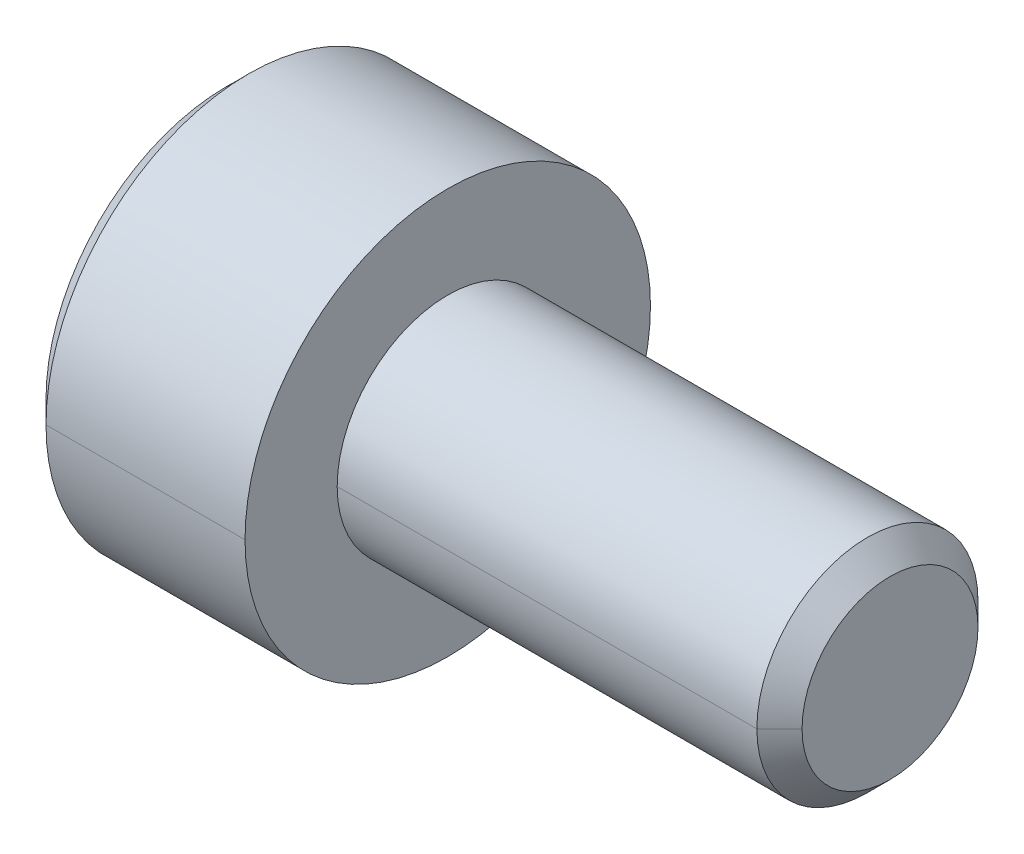
ISO-10303-21;
HEADER;
FILE_DESCRIPTION(('STEP AP214'),'2;1');
FILE_NAME('part.step','',(''),(''),'','','');
FILE_SCHEMA(('AUTOMOTIVE_DESIGN { 1 0 10303 214 1 1 1 1 }'));
ENDSEC;
DATA;
#1=APPLICATION_CONTEXT('core data for automotive mechanical design processes');
#2=APPLICATION_PROTOCOL_DEFINITION('international standard','automotive_design',2000,#1);
#3=PRODUCT_CONTEXT('',#1,'mechanical');
#4=PRODUCT('Part','Part','',(#3));
#5=PRODUCT_RELATED_PRODUCT_CATEGORY('part','',(#4));
#6=PRODUCT_DEFINITION_FORMATION('','',#4);
#7=PRODUCT_DEFINITION_CONTEXT('part definition',#1,'design');
#8=PRODUCT_DEFINITION('design','',#6,#7);
#9=PRODUCT_DEFINITION_SHAPE('','',#8);
#10=(LENGTH_UNIT() NAMED_UNIT(*) SI_UNIT(.MILLI.,.METRE.));
#11=(NAMED_UNIT(*) PLANE_ANGLE_UNIT() SI_UNIT($,.RADIAN.));
#12=(NAMED_UNIT(*) SI_UNIT($,.STERADIAN.) SOLID_ANGLE_UNIT());
#13=UNCERTAINTY_MEASURE_WITH_UNIT(LENGTH_MEASURE(1.E-05),#10,'distance_accuracy_value','');
#14=(GEOMETRIC_REPRESENTATION_CONTEXT(3) GLOBAL_UNCERTAINTY_ASSIGNED_CONTEXT((#13)) GLOBAL_UNIT_ASSIGNED_CONTEXT((#10,
#11,#12)) REPRESENTATION_CONTEXT('',''));
#15=CARTESIAN_POINT('',(0.,0.,0.));
#16=DIRECTION('',(0.,0.,1.));
#17=DIRECTION('',(1.,0.,0.));
#18=AXIS2_PLACEMENT_3D('',#15,#16,#17);
#19=CARTESIAN_POINT('',(-3.,0.,0.));
#20=DIRECTION('',(1.,0.,0.));
#21=DIRECTION('',(0.,-1.,0.));
#22=AXIS2_PLACEMENT_3D('',#19,#20,#21);
#23=CONICAL_SURFACE('',#22,2.45,0.7853981634);
#24=CARTESIAN_POINT('',(-2.7,0.,0.));
#25=DIRECTION('',(1.,0.,0.));
#26=DIRECTION('',(0.,0.,-1.));
#27=AXIS2_PLACEMENT_3D('',#24,#25,#26);
#28=CIRCLE('',#27,2.75);
#29=CARTESIAN_POINT('',(-2.7,0.,-2.75));
#30=VERTEX_POINT('',#29);
#31=CARTESIAN_POINT('',(-2.70000000000077,0.,2.75000000000077));
#32=VERTEX_POINT('',#31);
#33=EDGE_CURVE('E12',#30,#32,#28,.T.);
#34=ORIENTED_EDGE('',*,*,#33,.F.);
#35=CARTESIAN_POINT('',(-3.,0.,-2.45));
#36=DIRECTION('',(0.707106781184743,0.,-0.707106781188352));
#37=VECTOR('',#36,1.);
#38=LINE('',#35,#37);
#39=CARTESIAN_POINT('',(-3.,0.,-2.45));
#40=VERTEX_POINT('',#39);
#41=EDGE_CURVE('E30',#40,#30,#38,.T.);
#42=ORIENTED_EDGE('',*,*,#41,.F.);
#43=CARTESIAN_POINT('',(-3.,0.,0.));
#44=DIRECTION('',(1.,0.,0.));
#45=DIRECTION('',(0.,0.,-1.));
#46=AXIS2_PLACEMENT_3D('',#43,#44,#45);
#47=CIRCLE('',#46,2.45);
#48=CARTESIAN_POINT('',(-3.,0.,2.45));
#49=VERTEX_POINT('',#48);
#50=EDGE_CURVE('E958',#40,#49,#47,.T.);
#51=ORIENTED_EDGE('',*,*,#50,.T.);
#52=CARTESIAN_POINT('',(-3.,0.,2.45));
#53=DIRECTION('',(0.707106781184743,0.,0.707106781188352));
#54=VECTOR('',#53,1.);
#55=LINE('',#52,#54);
#56=EDGE_CURVE('E371',#49,#32,#55,.T.);
#57=ORIENTED_EDGE('',*,*,#56,.T.);
#58=EDGE_LOOP('',(#34,#42,#51,#57));
#59=FACE_BOUND('',#58,.T.);
#60=ADVANCED_FACE('F20',(#59),#23,.T.);
#61=CARTESIAN_POINT('',(-3.,0.,0.));
#62=DIRECTION('',(1.,0.,0.));
#63=DIRECTION('',(0.,1.,0.));
#64=AXIS2_PLACEMENT_3D('',#61,#62,#63);
#65=CONICAL_SURFACE('',#64,2.45,0.7853981634);
#66=CARTESIAN_POINT('',(-3.,0.,0.));
#67=DIRECTION('',(1.,0.,0.));
#68=DIRECTION('',(0.,0.,-1.));
#69=AXIS2_PLACEMENT_3D('',#66,#67,#68);
#70=CIRCLE('',#69,2.45);
#71=EDGE_CURVE('E376',#49,#40,#70,.T.);
#72=ORIENTED_EDGE('',*,*,#71,.T.);
#73=ORIENTED_EDGE('',*,*,#41,.T.);
#74=CARTESIAN_POINT('',(-2.7,0.,0.));
#75=DIRECTION('',(1.,0.,0.));
#76=DIRECTION('',(0.,0.,-1.));
#77=AXIS2_PLACEMENT_3D('',#74,#75,#76);
#78=CIRCLE('',#77,2.75);
#79=EDGE_CURVE('E373',#32,#30,#78,.T.);
#80=ORIENTED_EDGE('',*,*,#79,.F.);
#81=ORIENTED_EDGE('',*,*,#56,.F.);
#82=EDGE_LOOP('',(#72,#73,#80,#81));
#83=FACE_BOUND('',#82,.T.);
#84=ADVANCED_FACE('F344',(#83),#65,.T.);
#85=CARTESIAN_POINT('',(6.,0.,0.));
#86=DIRECTION('',(-1.,0.,0.));
#87=DIRECTION('',(0.,1.,0.));
#88=AXIS2_PLACEMENT_3D('',#85,#86,#87);
#89=CYLINDRICAL_SURFACE('',#88,2.75);
#90=ORIENTED_EDGE('',*,*,#79,.T.);
#91=CARTESIAN_POINT('',(0.,0.,-2.75));
#92=DIRECTION('',(-1.,0.,0.));
#93=VECTOR('',#92,1.);
#94=LINE('',#91,#93);
#95=CARTESIAN_POINT('',(0.,0.,-2.75));
#96=VERTEX_POINT('',#95);
#97=EDGE_CURVE('E377',#96,#30,#94,.T.);
#98=ORIENTED_EDGE('',*,*,#97,.F.);
#99=CARTESIAN_POINT('',(0.,0.,0.));
#100=DIRECTION('',(1.,0.,0.));
#101=DIRECTION('',(0.,0.,-1.));
#102=AXIS2_PLACEMENT_3D('',#99,#100,#101);
#103=CIRCLE('',#102,2.75);
#104=CARTESIAN_POINT('',(0.,0.,2.75));
#105=VERTEX_POINT('',#104);
#106=EDGE_CURVE('E384',#105,#96,#103,.T.);
#107=ORIENTED_EDGE('',*,*,#106,.F.);
#108=CARTESIAN_POINT('',(0.,0.,2.75));
#109=DIRECTION('',(-1.,0.,0.));
#110=VECTOR('',#109,1.);
#111=LINE('',#108,#110);
#112=EDGE_CURVE('E390',#105,#32,#111,.T.);
#113=ORIENTED_EDGE('',*,*,#112,.T.);
#114=EDGE_LOOP('',(#90,#98,#107,#113));
#115=FACE_BOUND('',#114,.T.);
#116=ADVANCED_FACE('F353',(#115),#89,.T.);
#117=CARTESIAN_POINT('',(6.,0.,0.));
#118=DIRECTION('',(-1.,0.,0.));
#119=DIRECTION('',(0.,-1.,0.));
#120=AXIS2_PLACEMENT_3D('',#117,#118,#119);
#121=CYLINDRICAL_SURFACE('',#120,2.75);
#122=CARTESIAN_POINT('',(0.,0.,0.));
#123=DIRECTION('',(1.,0.,0.));
#124=DIRECTION('',(0.,0.,-1.));
#125=AXIS2_PLACEMENT_3D('',#122,#123,#124);
#126=CIRCLE('',#125,2.75);
#127=EDGE_CURVE('E395',#96,#105,#126,.T.);
#128=ORIENTED_EDGE('',*,*,#127,.F.);
#129=ORIENTED_EDGE('',*,*,#97,.T.);
#130=ORIENTED_EDGE('',*,*,#33,.T.);
#131=ORIENTED_EDGE('',*,*,#112,.F.);
#132=EDGE_LOOP('',(#128,#129,#130,#131));
#133=FACE_BOUND('',#132,.T.);
#134=ADVANCED_FACE('F508',(#133),#121,.T.);
#135=CARTESIAN_POINT('',(0.,2.75,0.));
#136=DIRECTION('',(-1.,0.,0.));
#137=DIRECTION('',(0.,0.,1.));
#138=AXIS2_PLACEMENT_3D('',#135,#136,#137);
#139=PLANE('',#138);
#140=CARTESIAN_POINT('',(0.,0.,0.));
#141=DIRECTION('',(1.,0.,0.));
#142=DIRECTION('',(0.,0.,-1.));
#143=AXIS2_PLACEMENT_3D('',#140,#141,#142);
#144=CIRCLE('',#143,1.5);
#145=CARTESIAN_POINT('',(0.,0.,-1.5));
#146=VERTEX_POINT('',#145);
#147=CARTESIAN_POINT('',(0.,0.,1.5));
#148=VERTEX_POINT('',#147);
#149=EDGE_CURVE('E498',#146,#148,#144,.T.);
#150=ORIENTED_EDGE('',*,*,#149,.F.);
#151=CARTESIAN_POINT('',(0.,0.,0.));
#152=DIRECTION('',(1.,0.,0.));
#153=DIRECTION('',(0.,0.,-1.));
#154=AXIS2_PLACEMENT_3D('',#151,#152,#153);
#155=CIRCLE('',#154,1.5);
#156=EDGE_CURVE('E497',#148,#146,#155,.T.);
#157=ORIENTED_EDGE('',*,*,#156,.F.);
#158=EDGE_LOOP('',(#150,#157));
#159=FACE_BOUND('',#158,.T.);
#160=ORIENTED_EDGE('',*,*,#127,.T.);
#161=ORIENTED_EDGE('',*,*,#106,.T.);
#162=EDGE_LOOP('',(#160,#161));
#163=FACE_BOUND('',#162,.T.);
#164=ADVANCED_FACE('F516',(#159,#163),#139,.F.);
#165=CARTESIAN_POINT('',(6.,0.,0.));
#166=DIRECTION('',(-1.,0.,0.));
#167=DIRECTION('',(0.,1.,0.));
#168=AXIS2_PLACEMENT_3D('',#165,#166,#167);
#169=CYLINDRICAL_SURFACE('',#168,1.5);
#170=ORIENTED_EDGE('',*,*,#156,.T.);
#171=CARTESIAN_POINT('',(5.6935,0.,-1.5));
#172=DIRECTION('',(-1.,0.,0.));
#173=VECTOR('',#172,1.);
#174=LINE('',#171,#173);
#175=CARTESIAN_POINT('',(5.6935,0.,-1.5));
#176=VERTEX_POINT('',#175);
#177=EDGE_CURVE('E482',#176,#146,#174,.T.);
#178=ORIENTED_EDGE('',*,*,#177,.F.);
#179=CARTESIAN_POINT('',(5.6935,0.,0.));
#180=DIRECTION('',(1.,0.,0.));
#181=DIRECTION('',(0.,0.,-1.));
#182=AXIS2_PLACEMENT_3D('',#179,#180,#181);
#183=CIRCLE('',#182,1.5);
#184=CARTESIAN_POINT('',(5.6935,0.,1.5));
#185=VERTEX_POINT('',#184);
#186=EDGE_CURVE('E479',#185,#176,#183,.T.);
#187=ORIENTED_EDGE('',*,*,#186,.F.);
#188=CARTESIAN_POINT('',(5.6935,0.,1.5));
#189=DIRECTION('',(-1.,0.,0.));
#190=VECTOR('',#189,1.);
#191=LINE('',#188,#190);
#192=EDGE_CURVE('E477',#185,#148,#191,.T.);
#193=ORIENTED_EDGE('',*,*,#192,.T.);
#194=EDGE_LOOP('',(#170,#178,#187,#193));
#195=FACE_BOUND('',#194,.T.);
#196=ADVANCED_FACE('F443',(#195),#169,.T.);
#197=CARTESIAN_POINT('',(6.,0.,0.));
#198=DIRECTION('',(-1.,0.,0.));
#199=DIRECTION('',(0.,-1.,0.));
#200=AXIS2_PLACEMENT_3D('',#197,#198,#199);
#201=CYLINDRICAL_SURFACE('',#200,1.5);
#202=CARTESIAN_POINT('',(5.6935,0.,0.));
#203=DIRECTION('',(1.,0.,0.));
#204=DIRECTION('',(0.,0.,-1.));
#205=AXIS2_PLACEMENT_3D('',#202,#203,#204);
#206=CIRCLE('',#205,1.5);
#207=EDGE_CURVE('E918',#176,#185,#206,.T.);
#208=ORIENTED_EDGE('',*,*,#207,.F.);
#209=ORIENTED_EDGE('',*,*,#177,.T.);
#210=ORIENTED_EDGE('',*,*,#149,.T.);
#211=ORIENTED_EDGE('',*,*,#192,.F.);
#212=EDGE_LOOP('',(#208,#209,#210,#211));
#213=FACE_BOUND('',#212,.T.);
#214=ADVANCED_FACE('F434',(#213),#201,.T.);
#215=CARTESIAN_POINT('',(5.6935,0.,0.));
#216=DIRECTION('',(-1.,0.,0.));
#217=DIRECTION('',(0.,-1.,0.));
#218=AXIS2_PLACEMENT_3D('',#215,#216,#217);
#219=CONICAL_SURFACE('',#218,1.5,0.7853981634);
#220=CARTESIAN_POINT('',(6.,0.,0.));
#221=DIRECTION('',(1.,0.,0.));
#222=DIRECTION('',(0.,0.,-1.));
#223=AXIS2_PLACEMENT_3D('',#220,#221,#222);
#224=CIRCLE('',#223,1.1935);
#225=CARTESIAN_POINT('',(6.,0.,-1.1935));
#226=VERTEX_POINT('',#225);
#227=CARTESIAN_POINT('',(5.99999999999922,0.,1.19349999999922));
#228=VERTEX_POINT('',#227);
#229=EDGE_CURVE('E427',#226,#228,#224,.T.);
#230=ORIENTED_EDGE('',*,*,#229,.F.);
#231=CARTESIAN_POINT('',(5.99999999999922,0.,-1.19349999999922));
#232=DIRECTION('',(-0.707106781184743,0.,-0.707106781188352));
#233=VECTOR('',#232,1.);
#234=LINE('',#231,#233);
#235=EDGE_CURVE('E305',#226,#176,#234,.T.);
#236=ORIENTED_EDGE('',*,*,#235,.T.);
#237=ORIENTED_EDGE('',*,*,#207,.T.);
#238=CARTESIAN_POINT('',(5.99999999999922,0.,1.19349999999922));
#239=DIRECTION('',(-0.707106781184743,0.,0.707106781188352));
#240=VECTOR('',#239,1.);
#241=LINE('',#238,#240);
#242=EDGE_CURVE('E318',#228,#185,#241,.T.);
#243=ORIENTED_EDGE('',*,*,#242,.F.);
#244=EDGE_LOOP('',(#230,#236,#237,#243));
#245=FACE_BOUND('',#244,.T.);
#246=ADVANCED_FACE('F283',(#245),#219,.T.);
#247=CARTESIAN_POINT('',(5.6935,0.,0.));
#248=DIRECTION('',(-1.,0.,0.));
#249=DIRECTION('',(0.,1.,0.));
#250=AXIS2_PLACEMENT_3D('',#247,#248,#249);
#251=CONICAL_SURFACE('',#250,1.5,0.7853981634);
#252=ORIENTED_EDGE('',*,*,#186,.T.);
#253=ORIENTED_EDGE('',*,*,#235,.F.);
#254=CARTESIAN_POINT('',(6.,0.,0.));
#255=DIRECTION('',(1.,0.,0.));
#256=DIRECTION('',(0.,0.,-1.));
#257=AXIS2_PLACEMENT_3D('',#254,#255,#256);
#258=CIRCLE('',#257,1.1935);
#259=EDGE_CURVE('E911',#228,#226,#258,.T.);
#260=ORIENTED_EDGE('',*,*,#259,.F.);
#261=ORIENTED_EDGE('',*,*,#242,.T.);
#262=EDGE_LOOP('',(#252,#253,#260,#261));
#263=FACE_BOUND('',#262,.T.);
#264=ADVANCED_FACE('F272',(#263),#251,.T.);
#265=CARTESIAN_POINT('',(6.,1.1935,0.));
#266=DIRECTION('',(-1.,0.,0.));
#267=DIRECTION('',(0.,0.,1.));
#268=AXIS2_PLACEMENT_3D('',#265,#266,#267);
#269=PLANE('',#268);
#270=ORIENTED_EDGE('',*,*,#229,.T.);
#271=ORIENTED_EDGE('',*,*,#259,.T.);
#272=EDGE_LOOP('',(#270,#271));
#273=FACE_BOUND('',#272,.T.);
#274=ADVANCED_FACE('F282',(#273),#269,.F.);
#275=CARTESIAN_POINT('',(-3.,0.,0.));
#276=DIRECTION('',(1.,0.,0.));
#277=DIRECTION('',(0.,0.,-1.));
#278=AXIS2_PLACEMENT_3D('',#275,#276,#277);
#279=PLANE('',#278);
#280=ORIENTED_EDGE('',*,*,#50,.F.);
#281=ORIENTED_EDGE('',*,*,#71,.F.);
#282=EDGE_LOOP('',(#280,#281));
#283=FACE_BOUND('',#282,.T.);
#284=DIRECTION('',(0.,0.50000000000002,-0.866025403784427));
#285=VECTOR('',#284,1.);
#286=CARTESIAN_POINT('',(-3.,-1.4433756729741,0.));
#287=LINE('',#286,#285);
#288=CARTESIAN_POINT('',(-3.,-1.4433756729741,0.));
#289=VERTEX_POINT('',#288);
#290=CARTESIAN_POINT('',(-3.,-0.72168783648703,-1.25));
#291=VERTEX_POINT('',#290);
#292=EDGE_CURVE('E263',#289,#291,#287,.T.);
#293=ORIENTED_EDGE('',*,*,#292,.T.);
#294=DIRECTION('',(0.,1.,0.));
#295=VECTOR('',#294,1.);
#296=CARTESIAN_POINT('',(-3.,-0.72168783648703,-1.25));
#297=LINE('',#296,#295);
#298=CARTESIAN_POINT('',(-3.,0.72168783648703,-1.25));
#299=VERTEX_POINT('',#298);
#300=EDGE_CURVE('E895',#291,#299,#297,.T.);
#301=ORIENTED_EDGE('',*,*,#300,.T.);
#302=DIRECTION('',(0.,0.50000000000002,0.866025403784427));
#303=VECTOR('',#302,1.);
#304=CARTESIAN_POINT('',(-3.,0.72168783648703,-1.25));
#305=LINE('',#304,#303);
#306=CARTESIAN_POINT('',(-3.,1.4433756729741,0.));
#307=VERTEX_POINT('',#306);
#308=EDGE_CURVE('E891',#299,#307,#305,.T.);
#309=ORIENTED_EDGE('',*,*,#308,.T.);
#310=DIRECTION('',(0.,-0.50000000000002,0.866025403784427));
#311=VECTOR('',#310,1.);
#312=CARTESIAN_POINT('',(-3.,1.4433756729741,0.));
#313=LINE('',#312,#311);
#314=CARTESIAN_POINT('',(-3.,0.72168783648703,1.25));
#315=VERTEX_POINT('',#314);
#316=EDGE_CURVE('E887',#307,#315,#313,.T.);
#317=ORIENTED_EDGE('',*,*,#316,.T.);
#318=DIRECTION('',(0.,-1.,0.));
#319=VECTOR('',#318,1.);
#320=CARTESIAN_POINT('',(-3.,0.72168783648703,1.25));
#321=LINE('',#320,#319);
#322=CARTESIAN_POINT('',(-3.,-0.72168783648703,1.25));
#323=VERTEX_POINT('',#322);
#324=EDGE_CURVE('E246',#315,#323,#321,.T.);
#325=ORIENTED_EDGE('',*,*,#324,.T.);
#326=DIRECTION('',(0.,-0.50000000000002,-0.866025403784427));
#327=VECTOR('',#326,1.);
#328=CARTESIAN_POINT('',(-3.,-0.72168783648703,1.25));
#329=LINE('',#328,#327);
#330=EDGE_CURVE('E241',#323,#289,#329,.T.);
#331=ORIENTED_EDGE('',*,*,#330,.T.);
#332=EDGE_LOOP('',(#293,#301,#309,#317,#325,#331));
#333=FACE_BOUND('',#332,.T.);
#334=ADVANCED_FACE('F581',(#283,#333),#279,.F.);
#335=CARTESIAN_POINT('',(-1.7,-0.72168783648703,1.25));
#336=DIRECTION('',(0.,0.866025403784427,-0.50000000000002));
#337=DIRECTION('',(0.,0.50000000000002,0.866025403784427));
#338=AXIS2_PLACEMENT_3D('',#335,#336,#337);
#339=PLANE('',#338);
#340=ORIENTED_EDGE('',*,*,#330,.F.);
#341=DIRECTION('',(-1.,0.,0.));
#342=VECTOR('',#341,1.);
#343=CARTESIAN_POINT('',(-1.7,-0.72168783648703,1.25));
#344=LINE('',#343,#342);
#345=CARTESIAN_POINT('',(-1.7,-0.72168783648703,1.25));
#346=VERTEX_POINT('',#345);
#347=EDGE_CURVE('E235',#346,#323,#344,.T.);
#348=ORIENTED_EDGE('',*,*,#347,.F.);
#349=DIRECTION('',(0.,-0.50000000000002,-0.866025403784427));
#350=VECTOR('',#349,1.);
#351=CARTESIAN_POINT('',(-1.7,-0.72168783648703,1.25));
#352=LINE('',#351,#350);
#353=CARTESIAN_POINT('',(-1.7,-1.08253175473055,0.625000000000032));
#354=VERTEX_POINT('',#353);
#355=EDGE_CURVE('E230',#346,#354,#352,.T.);
#356=ORIENTED_EDGE('',*,*,#355,.T.);
#357=DIRECTION('',(0.,-0.50000000000002,-0.866025403784427));
#358=VECTOR('',#357,1.);
#359=CARTESIAN_POINT('',(-1.7,-0.72168783648703,1.25));
#360=LINE('',#359,#358);
#361=CARTESIAN_POINT('',(-1.7,-1.4433756729741,0.));
#362=VERTEX_POINT('',#361);
#363=EDGE_CURVE('E225',#354,#362,#360,.T.);
#364=ORIENTED_EDGE('',*,*,#363,.T.);
#365=DIRECTION('',(-1.,0.,0.));
#366=VECTOR('',#365,1.);
#367=CARTESIAN_POINT('',(-1.7,-1.4433756729741,0.));
#368=LINE('',#367,#366);
#369=EDGE_CURVE('E219',#362,#289,#368,.T.);
#370=ORIENTED_EDGE('',*,*,#369,.T.);
#371=EDGE_LOOP('',(#340,#348,#356,#364,#370));
#372=FACE_BOUND('',#371,.T.);
#373=ADVANCED_FACE('F589',(#372),#339,.T.);
#374=CARTESIAN_POINT('',(-1.7,-1.4433756729741,0.));
#375=DIRECTION('',(0.,0.866025403784427,0.50000000000002));
#376=DIRECTION('',(0.,-0.50000000000002,0.866025403784427));
#377=AXIS2_PLACEMENT_3D('',#374,#375,#376);
#378=PLANE('',#377);
#379=ORIENTED_EDGE('',*,*,#292,.F.);
#380=ORIENTED_EDGE('',*,*,#369,.F.);
#381=DIRECTION('',(0.,0.50000000000002,-0.866025403784427));
#382=VECTOR('',#381,1.);
#383=CARTESIAN_POINT('',(-1.7,-1.4433756729741,0.));
#384=LINE('',#383,#382);
#385=CARTESIAN_POINT('',(-1.7,-1.08253175473053,-0.625000000000024));
#386=VERTEX_POINT('',#385);
#387=EDGE_CURVE('E214',#362,#386,#384,.T.);
#388=ORIENTED_EDGE('',*,*,#387,.T.);
#389=DIRECTION('',(0.,0.50000000000002,-0.866025403784427));
#390=VECTOR('',#389,1.);
#391=CARTESIAN_POINT('',(-1.7,-1.4433756729741,0.));
#392=LINE('',#391,#390);
#393=CARTESIAN_POINT('',(-1.7,-0.72168783648703,-1.25));
#394=VERTEX_POINT('',#393);
#395=EDGE_CURVE('E209',#386,#394,#392,.T.);
#396=ORIENTED_EDGE('',*,*,#395,.T.);
#397=DIRECTION('',(-1.,0.,0.));
#398=VECTOR('',#397,1.);
#399=CARTESIAN_POINT('',(-1.7,-0.72168783648703,-1.25));
#400=LINE('',#399,#398);
#401=EDGE_CURVE('E203',#394,#291,#400,.T.);
#402=ORIENTED_EDGE('',*,*,#401,.T.);
#403=EDGE_LOOP('',(#379,#380,#388,#396,#402));
#404=FACE_BOUND('',#403,.T.);
#405=ADVANCED_FACE('F597',(#404),#378,.T.);
#406=CARTESIAN_POINT('',(-1.7,-0.72168783648703,-1.25));
#407=DIRECTION('',(0.,0.,1.));
#408=DIRECTION('',(1.,0.,0.));
#409=AXIS2_PLACEMENT_3D('',#406,#407,#408);
#410=PLANE('',#409);
#411=ORIENTED_EDGE('',*,*,#300,.F.);
#412=ORIENTED_EDGE('',*,*,#401,.F.);
#413=DIRECTION('',(0.,1.,0.));
#414=VECTOR('',#413,1.);
#415=CARTESIAN_POINT('',(-1.7,-0.72168783648703,-1.25));
#416=LINE('',#415,#414);
#417=CARTESIAN_POINT('',(-1.7,0.,-1.25));
#418=VERTEX_POINT('',#417);
#419=EDGE_CURVE('E198',#394,#418,#416,.T.);
#420=ORIENTED_EDGE('',*,*,#419,.T.);
#421=DIRECTION('',(0.,1.,0.));
#422=VECTOR('',#421,1.);
#423=CARTESIAN_POINT('',(-1.7,-0.72168783648703,-1.25));
#424=LINE('',#423,#422);
#425=CARTESIAN_POINT('',(-1.7,0.72168783648703,-1.25));
#426=VERTEX_POINT('',#425);
#427=EDGE_CURVE('E193',#418,#426,#424,.T.);
#428=ORIENTED_EDGE('',*,*,#427,.T.);
#429=DIRECTION('',(-1.,0.,0.));
#430=VECTOR('',#429,1.);
#431=CARTESIAN_POINT('',(-1.7,0.72168783648703,-1.25));
#432=LINE('',#431,#430);
#433=EDGE_CURVE('E187',#426,#299,#432,.T.);
#434=ORIENTED_EDGE('',*,*,#433,.T.);
#435=EDGE_LOOP('',(#411,#412,#420,#428,#434));
#436=FACE_BOUND('',#435,.T.);
#437=ADVANCED_FACE('F606',(#436),#410,.T.);
#438=CARTESIAN_POINT('',(-1.7,0.72168783648703,-1.25));
#439=DIRECTION('',(0.,-0.866025403784427,0.50000000000002));
#440=DIRECTION('',(0.,-0.50000000000002,-0.866025403784427));
#441=AXIS2_PLACEMENT_3D('',#438,#439,#440);
#442=PLANE('',#441);
#443=ORIENTED_EDGE('',*,*,#308,.F.);
#444=ORIENTED_EDGE('',*,*,#433,.F.);
#445=DIRECTION('',(0.,0.50000000000002,0.866025403784427));
#446=VECTOR('',#445,1.);
#447=CARTESIAN_POINT('',(-1.7,0.72168783648703,-1.25));
#448=LINE('',#447,#446);
#449=CARTESIAN_POINT('',(-1.7,1.08253175473055,-0.625000000000032));
#450=VERTEX_POINT('',#449);
#451=EDGE_CURVE('E183',#426,#450,#448,.T.);
#452=ORIENTED_EDGE('',*,*,#451,.T.);
#453=DIRECTION('',(0.,0.50000000000002,0.866025403784427));
#454=VECTOR('',#453,1.);
#455=CARTESIAN_POINT('',(-1.7,0.72168783648703,-1.25));
#456=LINE('',#455,#454);
#457=CARTESIAN_POINT('',(-1.7,1.4433756729741,0.));
#458=VERTEX_POINT('',#457);
#459=EDGE_CURVE('E181',#450,#458,#456,.T.);
#460=ORIENTED_EDGE('',*,*,#459,.T.);
#461=DIRECTION('',(-1.,0.,0.));
#462=VECTOR('',#461,1.);
#463=CARTESIAN_POINT('',(-1.7,1.4433756729741,0.));
#464=LINE('',#463,#462);
#465=EDGE_CURVE('E868',#458,#307,#464,.T.);
#466=ORIENTED_EDGE('',*,*,#465,.T.);
#467=EDGE_LOOP('',(#443,#444,#452,#460,#466));
#468=FACE_BOUND('',#467,.T.);
#469=ADVANCED_FACE('F615',(#468),#442,.T.);
#470=CARTESIAN_POINT('',(-1.7,1.4433756729741,0.));
#471=DIRECTION('',(0.,-0.866025403784427,-0.50000000000002));
#472=DIRECTION('',(0.,0.50000000000002,-0.866025403784427));
#473=AXIS2_PLACEMENT_3D('',#470,#471,#472);
#474=PLANE('',#473);
#475=ORIENTED_EDGE('',*,*,#316,.F.);
#476=ORIENTED_EDGE('',*,*,#465,.F.);
#477=DIRECTION('',(0.,-0.50000000000002,0.866025403784427));
#478=VECTOR('',#477,1.);
#479=CARTESIAN_POINT('',(-1.7,1.4433756729741,0.));
#480=LINE('',#479,#478);
#481=CARTESIAN_POINT('',(-1.7,1.08253175473055,0.625000000000032));
#482=VERTEX_POINT('',#481);
#483=EDGE_CURVE('E858',#458,#482,#480,.T.);
#484=ORIENTED_EDGE('',*,*,#483,.T.);
#485=DIRECTION('',(0.,-0.50000000000002,0.866025403784427));
#486=VECTOR('',#485,1.);
#487=CARTESIAN_POINT('',(-1.7,1.4433756729741,0.));
#488=LINE('',#487,#486);
#489=CARTESIAN_POINT('',(-1.7,0.72168783648703,1.25));
#490=VERTEX_POINT('',#489);
#491=EDGE_CURVE('E859',#482,#490,#488,.T.);
#492=ORIENTED_EDGE('',*,*,#491,.T.);
#493=DIRECTION('',(-1.,0.,0.));
#494=VECTOR('',#493,1.);
#495=CARTESIAN_POINT('',(-1.7,0.72168783648703,1.25));
#496=LINE('',#495,#494);
#497=EDGE_CURVE('E864',#490,#315,#496,.T.);
#498=ORIENTED_EDGE('',*,*,#497,.T.);
#499=EDGE_LOOP('',(#475,#476,#484,#492,#498));
#500=FACE_BOUND('',#499,.T.);
#501=ADVANCED_FACE('F624',(#500),#474,.T.);
#502=CARTESIAN_POINT('',(-1.7,0.72168783648703,1.25));
#503=DIRECTION('',(0.,0.,-1.));
#504=DIRECTION('',(-1.,0.,0.));
#505=AXIS2_PLACEMENT_3D('',#502,#503,#504);
#506=PLANE('',#505);
#507=ORIENTED_EDGE('',*,*,#324,.F.);
#508=ORIENTED_EDGE('',*,*,#497,.F.);
#509=DIRECTION('',(0.,-1.,0.));
#510=VECTOR('',#509,1.);
#511=CARTESIAN_POINT('',(-1.7,0.72168783648703,1.25));
#512=LINE('',#511,#510);
#513=CARTESIAN_POINT('',(-1.7,0.,1.25));
#514=VERTEX_POINT('',#513);
#515=EDGE_CURVE('E860',#490,#514,#512,.T.);
#516=ORIENTED_EDGE('',*,*,#515,.T.);
#517=DIRECTION('',(0.,-1.,0.));
#518=VECTOR('',#517,1.);
#519=CARTESIAN_POINT('',(-1.7,0.72168783648703,1.25));
#520=LINE('',#519,#518);
#521=EDGE_CURVE('E981',#514,#346,#520,.T.);
#522=ORIENTED_EDGE('',*,*,#521,.T.);
#523=ORIENTED_EDGE('',*,*,#347,.T.);
#524=EDGE_LOOP('',(#507,#508,#516,#522,#523));
#525=FACE_BOUND('',#524,.T.);
#526=ADVANCED_FACE('F633',(#525),#506,.T.);
#527=CARTESIAN_POINT('',(-1.7,0.,0.));
#528=DIRECTION('',(1.,0.,0.));
#529=DIRECTION('',(0.,0.,-1.));
#530=AXIS2_PLACEMENT_3D('',#527,#528,#529);
#531=PLANE('',#530);
#532=CARTESIAN_POINT('',(-1.7,0.,0.));
#533=DIRECTION('',(1.,0.,0.));
#534=DIRECTION('',(0.,0.,-1.));
#535=AXIS2_PLACEMENT_3D('',#532,#533,#534);
#536=CIRCLE('',#535,1.25);
#537=EDGE_CURVE('E139',#514,#354,#536,.T.);
#538=ORIENTED_EDGE('',*,*,#537,.T.);
#539=ORIENTED_EDGE('',*,*,#355,.F.);
#540=ORIENTED_EDGE('',*,*,#521,.F.);
#541=EDGE_LOOP('',(#538,#539,#540));
#542=FACE_BOUND('',#541,.T.);
#543=ADVANCED_FACE('F642',(#542),#531,.F.);
#544=CARTESIAN_POINT('',(-1.7,0.,0.));
#545=DIRECTION('',(-1.,0.,0.));
#546=DIRECTION('',(0.,1.,0.));
#547=AXIS2_PLACEMENT_3D('',#544,#545,#546);
#548=CONICAL_SURFACE('',#547,1.25,1.0471975512);
#549=CARTESIAN_POINT('',(-0.978312163518638,0.,0.));
#550=DIRECTION('',(-0.499999999997054,0.,-0.86602540378614));
#551=VECTOR('',#550,1.);
#552=LINE('',#549,#551);
#553=CARTESIAN_POINT('',(-0.97831216351297,0.,0.));
#554=VERTEX_POINT('',#553);
#555=EDGE_CURVE('E134',#554,#418,#552,.T.);
#556=ORIENTED_EDGE('',*,*,#555,.T.);
#557=CARTESIAN_POINT('',(-1.7,0.,0.));
#558=DIRECTION('',(1.,0.,0.));
#559=DIRECTION('',(0.,0.,-1.));
#560=AXIS2_PLACEMENT_3D('',#557,#558,#559);
#561=CIRCLE('',#560,1.25);
#562=EDGE_CURVE('E156',#386,#418,#561,.T.);
#563=ORIENTED_EDGE('',*,*,#562,.F.);
#564=CARTESIAN_POINT('',(-1.7,0.,0.));
#565=DIRECTION('',(1.,0.,0.));
#566=DIRECTION('',(0.,0.,-1.));
#567=AXIS2_PLACEMENT_3D('',#564,#565,#566);
#568=CIRCLE('',#567,1.25);
#569=EDGE_CURVE('E145',#354,#386,#568,.T.);
#570=ORIENTED_EDGE('',*,*,#569,.F.);
#571=ORIENTED_EDGE('',*,*,#537,.F.);
#572=CARTESIAN_POINT('',(-0.978312163518638,0.,0.));
#573=DIRECTION('',(-0.499999999997054,0.,0.86602540378614));
#574=VECTOR('',#573,1.);
#575=LINE('',#572,#574);
#576=EDGE_CURVE('E129',#554,#514,#575,.T.);
#577=ORIENTED_EDGE('',*,*,#576,.F.);
#578=EDGE_LOOP('',(#556,#563,#570,#571,#577));
#579=FACE_BOUND('',#578,.T.);
#580=ADVANCED_FACE('F132',(#579),#548,.F.);
#581=CARTESIAN_POINT('',(-1.7,0.,0.));
#582=DIRECTION('',(-1.,0.,0.));
#583=DIRECTION('',(0.,-1.,0.));
#584=AXIS2_PLACEMENT_3D('',#581,#582,#583);
#585=CONICAL_SURFACE('',#584,1.25,1.0471975512);
#586=ORIENTED_EDGE('',*,*,#576,.T.);
#587=CARTESIAN_POINT('',(-1.7,0.,0.));
#588=DIRECTION('',(1.,0.,0.));
#589=DIRECTION('',(0.,0.,-1.));
#590=AXIS2_PLACEMENT_3D('',#587,#588,#589);
#591=CIRCLE('',#590,1.25);
#592=EDGE_CURVE('E146',#482,#514,#591,.T.);
#593=ORIENTED_EDGE('',*,*,#592,.F.);
#594=CARTESIAN_POINT('',(-1.7,0.,0.));
#595=DIRECTION('',(1.,0.,0.));
#596=DIRECTION('',(0.,0.,-1.));
#597=AXIS2_PLACEMENT_3D('',#594,#595,#596);
#598=CIRCLE('',#597,1.25);
#599=EDGE_CURVE('E164',#450,#482,#598,.T.);
#600=ORIENTED_EDGE('',*,*,#599,.F.);
#601=CARTESIAN_POINT('',(-1.7,0.,0.));
#602=DIRECTION('',(1.,0.,0.));
#603=DIRECTION('',(0.,0.,-1.));
#604=AXIS2_PLACEMENT_3D('',#601,#602,#603);
#605=CIRCLE('',#604,1.25);
#606=EDGE_CURVE('E153',#418,#450,#605,.T.);
#607=ORIENTED_EDGE('',*,*,#606,.F.);
#608=ORIENTED_EDGE('',*,*,#555,.F.);
#609=EDGE_LOOP('',(#586,#593,#600,#607,#608));
#610=FACE_BOUND('',#609,.T.);
#611=ADVANCED_FACE('F150',(#610),#585,.F.);
#612=CARTESIAN_POINT('',(-1.7,0.,0.));
#613=DIRECTION('',(1.,0.,0.));
#614=DIRECTION('',(0.,0.,-1.));
#615=AXIS2_PLACEMENT_3D('',#612,#613,#614);
#616=PLANE('',#615);
#617=ORIENTED_EDGE('',*,*,#606,.T.);
#618=ORIENTED_EDGE('',*,*,#451,.F.);
#619=ORIENTED_EDGE('',*,*,#427,.F.);
#620=EDGE_LOOP('',(#617,#618,#619));
#621=FACE_BOUND('',#620,.T.);
#622=ADVANCED_FACE('F666',(#621),#616,.F.);
#623=CARTESIAN_POINT('',(-1.7,0.,0.));
#624=DIRECTION('',(1.,0.,0.));
#625=DIRECTION('',(0.,0.,-1.));
#626=AXIS2_PLACEMENT_3D('',#623,#624,#625);
#627=PLANE('',#626);
#628=ORIENTED_EDGE('',*,*,#459,.F.);
#629=ORIENTED_EDGE('',*,*,#599,.T.);
#630=ORIENTED_EDGE('',*,*,#483,.F.);
#631=EDGE_LOOP('',(#628,#629,#630));
#632=FACE_BOUND('',#631,.T.);
#633=ADVANCED_FACE('F673',(#632),#627,.F.);
#634=CARTESIAN_POINT('',(-1.7,0.,0.));
#635=DIRECTION('',(1.,0.,0.));
#636=DIRECTION('',(0.,0.,-1.));
#637=AXIS2_PLACEMENT_3D('',#634,#635,#636);
#638=PLANE('',#637);
#639=ORIENTED_EDGE('',*,*,#592,.T.);
#640=ORIENTED_EDGE('',*,*,#515,.F.);
#641=ORIENTED_EDGE('',*,*,#491,.F.);
#642=EDGE_LOOP('',(#639,#640,#641));
#643=FACE_BOUND('',#642,.T.);
#644=ADVANCED_FACE('F682',(#643),#638,.F.);
#645=CARTESIAN_POINT('',(-1.7,0.,0.));
#646=DIRECTION('',(1.,0.,0.));
#647=DIRECTION('',(0.,0.,-1.));
#648=AXIS2_PLACEMENT_3D('',#645,#646,#647);
#649=PLANE('',#648);
#650=ORIENTED_EDGE('',*,*,#569,.T.);
#651=ORIENTED_EDGE('',*,*,#387,.F.);
#652=ORIENTED_EDGE('',*,*,#363,.F.);
#653=EDGE_LOOP('',(#650,#651,#652));
#654=FACE_BOUND('',#653,.T.);
#655=ADVANCED_FACE('F691',(#654),#649,.F.);
#656=CARTESIAN_POINT('',(-1.7,0.,0.));
#657=DIRECTION('',(1.,0.,0.));
#658=DIRECTION('',(0.,0.,-1.));
#659=AXIS2_PLACEMENT_3D('',#656,#657,#658);
#660=PLANE('',#659);
#661=ORIENTED_EDGE('',*,*,#562,.T.);
#662=ORIENTED_EDGE('',*,*,#419,.F.);
#663=ORIENTED_EDGE('',*,*,#395,.F.);
#664=EDGE_LOOP('',(#661,#662,#663));
#665=FACE_BOUND('',#664,.T.);
#666=ADVANCED_FACE('F700',(#665),#660,.F.);
#667=CLOSED_SHELL('',(#60,#84,#116,#134,#164,#196,#214,#246,#264,#274,#334,#373,#405,#437,#469,
#501,#526,#543,#580,#611,#622,#633,#644,#655,#666));
#668=MANIFOLD_SOLID_BREP('B1',#667);
#669=ADVANCED_BREP_SHAPE_REPRESENTATION('',(#18,#668),#14);
#670=SHAPE_DEFINITION_REPRESENTATION(#9,#669);
ENDSEC;
END-ISO-10303-21;
